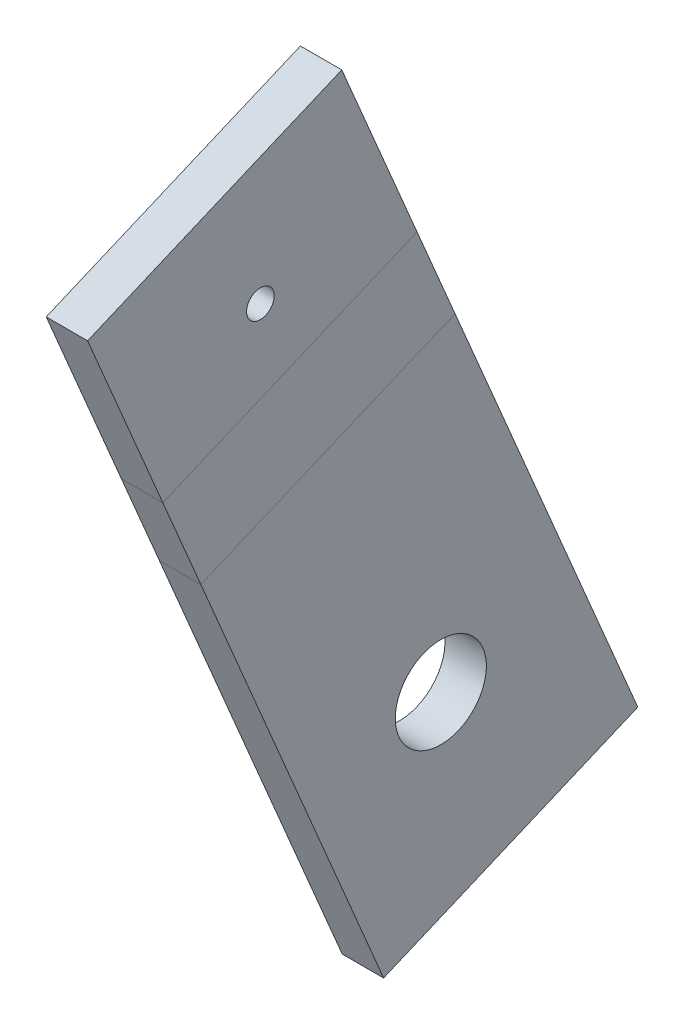
ISO-10303-21;
HEADER;
FILE_DESCRIPTION(('STEP AP214'),'2;1');
FILE_NAME('part.step','',(''),(''),'','','');
FILE_SCHEMA(('AUTOMOTIVE_DESIGN { 1 0 10303 214 1 1 1 1 }'));
ENDSEC;
DATA;
#1=APPLICATION_CONTEXT('core data for automotive mechanical design processes');
#2=APPLICATION_PROTOCOL_DEFINITION('international standard','automotive_design',2000,#1);
#3=PRODUCT_CONTEXT('',#1,'mechanical');
#4=PRODUCT('Part','Part','',(#3));
#5=PRODUCT_RELATED_PRODUCT_CATEGORY('part','',(#4));
#6=PRODUCT_DEFINITION_FORMATION('','',#4);
#7=PRODUCT_DEFINITION_CONTEXT('part definition',#1,'design');
#8=PRODUCT_DEFINITION('design','',#6,#7);
#9=PRODUCT_DEFINITION_SHAPE('','',#8);
#10=(LENGTH_UNIT() NAMED_UNIT(*) SI_UNIT(.MILLI.,.METRE.));
#11=(NAMED_UNIT(*) PLANE_ANGLE_UNIT() SI_UNIT($,.RADIAN.));
#12=(NAMED_UNIT(*) SI_UNIT($,.STERADIAN.) SOLID_ANGLE_UNIT());
#13=UNCERTAINTY_MEASURE_WITH_UNIT(LENGTH_MEASURE(1.E-05),#10,'distance_accuracy_value','');
#14=(GEOMETRIC_REPRESENTATION_CONTEXT(3) GLOBAL_UNCERTAINTY_ASSIGNED_CONTEXT((#13)) GLOBAL_UNIT_ASSIGNED_CONTEXT((#10,
#11,#12)) REPRESENTATION_CONTEXT('',''));
#15=CARTESIAN_POINT('',(0.,0.,0.));
#16=DIRECTION('',(0.,0.,1.));
#17=DIRECTION('',(1.,0.,0.));
#18=AXIS2_PLACEMENT_3D('',#15,#16,#17);
#19=CARTESIAN_POINT('',(-38.3771215803497,11.0699999084454,24.8920330878985));
#20=DIRECTION('',(0.,-0.389568980996589,0.920997290465764));
#21=DIRECTION('',(1.,0.,0.));
#22=AXIS2_PLACEMENT_3D('',#19,#20,#21);
#23=PLANE('',#22);
#24=DIRECTION('',(0.,-0.920997290465764,-0.389568980996589));
#25=VECTOR('',#24,1.);
#26=CARTESIAN_POINT('',(-38.3771215803497,11.0699999084454,24.8920330878985));
#27=LINE('',#26,#25);
#28=CARTESIAN_POINT('',(-38.3771215803498,26.7269538463634,31.5147057648405));
#29=VERTEX_POINT('',#28);
#30=CARTESIAN_POINT('',(-38.3771215803497,13.8329917798427,26.0607400308882));
#31=VERTEX_POINT('',#30);
#32=EDGE_CURVE('E180',#29,#31,#27,.T.);
#33=ORIENTED_EDGE('',*,*,#32,.T.);
#34=DIRECTION('',(-1.,0.,0.));
#35=VECTOR('',#34,1.);
#36=CARTESIAN_POINT('',(-35.3771215803497,13.8329917798427,26.0607400308882));
#37=LINE('',#36,#35);
#38=CARTESIAN_POINT('',(-35.3771215803497,13.8329917798427,26.0607400308882));
#39=VERTEX_POINT('',#38);
#40=EDGE_CURVE('E13',#39,#31,#37,.T.);
#41=ORIENTED_EDGE('',*,*,#40,.F.);
#42=DIRECTION('',(0.,0.920997290465764,0.389568980996589));
#43=VECTOR('',#42,1.);
#44=CARTESIAN_POINT('',(-35.3771215803499,43.6522330284253,38.6738622925477));
#45=LINE('',#44,#43);
#46=CARTESIAN_POINT('',(-35.3771215803498,26.7269538463634,31.5147057648405));
#47=VERTEX_POINT('',#46);
#48=EDGE_CURVE('E170',#47,#39,#45,.F.);
#49=ORIENTED_EDGE('',*,*,#48,.F.);
#50=DIRECTION('',(1.,0.,0.));
#51=VECTOR('',#50,1.);
#52=CARTESIAN_POINT('',(-38.3771215803498,26.7269538463634,31.5147057648405));
#53=LINE('',#52,#51);
#54=EDGE_CURVE('E90',#29,#47,#53,.T.);
#55=ORIENTED_EDGE('',*,*,#54,.F.);
#56=EDGE_LOOP('',(#33,#41,#49,#55));
#57=FACE_BOUND('',#56,.T.);
#58=ADVANCED_FACE('F59',(#57),#23,.T.);
#59=CARTESIAN_POINT('',(-38.3771215803498,34.5183334662952,13.0947599555252));
#60=DIRECTION('',(0.,0.389568980996589,-0.920997290465764));
#61=DIRECTION('',(-1.,0.,0.));
#62=AXIS2_PLACEMENT_3D('',#59,#60,#61);
#63=PLANE('',#62);
#64=DIRECTION('',(0.,-0.920997290465764,-0.389568980996589));
#65=VECTOR('',#64,1.);
#66=CARTESIAN_POINT('',(-35.3771215803499,51.4436126483571,20.2539164832324));
#67=LINE('',#66,#65);
#68=CARTESIAN_POINT('',(-35.3771215803497,21.6243713997745,7.64079422157293));
#69=VERTEX_POINT('',#68);
#70=CARTESIAN_POINT('',(-35.3771215803498,34.5183334662952,13.0947599555252));
#71=VERTEX_POINT('',#70);
#72=EDGE_CURVE('E97',#69,#71,#67,.F.);
#73=ORIENTED_EDGE('',*,*,#72,.F.);
#74=DIRECTION('',(-1.,0.,0.));
#75=VECTOR('',#74,1.);
#76=CARTESIAN_POINT('',(-38.3771215803497,21.6243713997745,7.64079422157295));
#77=LINE('',#76,#75);
#78=CARTESIAN_POINT('',(-38.3771215803497,21.6243713997745,7.64079422157293));
#79=VERTEX_POINT('',#78);
#80=EDGE_CURVE('E149',#69,#79,#77,.T.);
#81=ORIENTED_EDGE('',*,*,#80,.T.);
#82=DIRECTION('',(0.,0.920997290465764,0.389568980996589));
#83=VECTOR('',#82,1.);
#84=CARTESIAN_POINT('',(-38.3771215803498,34.5183334662952,13.0947599555252));
#85=LINE('',#84,#83);
#86=CARTESIAN_POINT('',(-38.3771215803498,34.5183334662952,13.0947599555252));
#87=VERTEX_POINT('',#86);
#88=EDGE_CURVE('E176',#79,#87,#85,.T.);
#89=ORIENTED_EDGE('',*,*,#88,.T.);
#90=DIRECTION('',(1.,0.,0.));
#91=VECTOR('',#90,1.);
#92=CARTESIAN_POINT('',(-38.3771215803498,34.5183334662952,13.0947599555252));
#93=LINE('',#92,#91);
#94=EDGE_CURVE('E163',#87,#71,#93,.T.);
#95=ORIENTED_EDGE('',*,*,#94,.T.);
#96=EDGE_LOOP('',(#73,#81,#89,#95));
#97=FACE_BOUND('',#96,.T.);
#98=ADVANCED_FACE('F61',(#97),#63,.T.);
#99=CARTESIAN_POINT('',(-38.3771215803499,50.9032673994056,21.531370629934));
#100=DIRECTION('',(-1.,0.,0.));
#101=DIRECTION('',(0.,-0.38956898099659,0.920997290465764));
#102=AXIS2_PLACEMENT_3D('',#99,#100,#101);
#103=PLANE('',#102);
#104=CARTESIAN_POINT('',(-38.3771215803497,22.7941666873702,18.9933965217118));
#105=DIRECTION('',(-1.,0.,0.));
#106=DIRECTION('',(0.,-0.38956898099659,0.920997290465764));
#107=AXIS2_PLACEMENT_3D('',#104,#105,#106);
#108=CIRCLE('',#107,1.);
#109=CARTESIAN_POINT('',(-38.3771215803497,22.4045977063736,19.9143938121776));
#110=VERTEX_POINT('',#109);
#111=EDGE_CURVE('E165',#110,#110,#108,.T.);
#112=ORIENTED_EDGE('',*,*,#111,.F.);
#113=EDGE_LOOP('',(#112));
#114=FACE_BOUND('',#113,.T.);
#115=ORIENTED_EDGE('',*,*,#88,.F.);
#116=DIRECTION('',(0.,-0.389568980996589,0.920997290465764));
#117=VECTOR('',#116,1.);
#118=CARTESIAN_POINT('',(-38.3771215803497,21.084026150823,8.91824836827452));
#119=LINE('',#118,#117);
#120=EDGE_CURVE('E135',#79,#31,#119,.T.);
#121=ORIENTED_EDGE('',*,*,#120,.T.);
#122=ORIENTED_EDGE('',*,*,#32,.F.);
#123=DIRECTION('',(0.,-0.38956898099659,0.920997290465764));
#124=VECTOR('',#123,1.);
#125=CARTESIAN_POINT('',(-38.3771215803498,26.7269538463634,31.5147057648405));
#126=LINE('',#125,#124);
#127=EDGE_CURVE('E178',#87,#29,#126,.T.);
#128=ORIENTED_EDGE('',*,*,#127,.F.);
#129=EDGE_LOOP('',(#115,#121,#122,#128));
#130=FACE_BOUND('',#129,.T.);
#131=ADVANCED_FACE('F228',(#114,#130),#103,.T.);
#132=CARTESIAN_POINT('',(-35.3771215803499,50.9032673994056,21.531370629934));
#133=DIRECTION('',(-1.,0.,0.));
#134=DIRECTION('',(0.,-0.38956898099659,0.920997290465764));
#135=AXIS2_PLACEMENT_3D('',#132,#133,#134);
#136=PLANE('',#135);
#137=CARTESIAN_POINT('',(-35.3771215803497,22.7941666873702,18.9933965217118));
#138=DIRECTION('',(1.,0.,0.));
#139=DIRECTION('',(0.,0.38956898099659,-0.920997290465764));
#140=AXIS2_PLACEMENT_3D('',#137,#138,#139);
#141=CIRCLE('',#140,1.);
#142=CARTESIAN_POINT('',(-35.3771215803497,23.1837356683668,18.072399231246));
#143=VERTEX_POINT('',#142);
#144=EDGE_CURVE('E187',#143,#143,#141,.T.);
#145=ORIENTED_EDGE('',*,*,#144,.F.);
#146=EDGE_LOOP('',(#145));
#147=FACE_BOUND('',#146,.T.);
#148=DIRECTION('',(0.,-0.389568980996589,0.920997290465764));
#149=VECTOR('',#148,1.);
#150=CARTESIAN_POINT('',(-35.3771215803497,21.6243713997745,7.64079422157295));
#151=LINE('',#150,#149);
#152=EDGE_CURVE('E68',#69,#39,#151,.T.);
#153=ORIENTED_EDGE('',*,*,#152,.F.);
#154=ORIENTED_EDGE('',*,*,#72,.T.);
#155=DIRECTION('',(0.,0.38956898099659,-0.920997290465764));
#156=VECTOR('',#155,1.);
#157=CARTESIAN_POINT('',(-35.3771215803498,33.9779882173437,14.3722141022268));
#158=LINE('',#157,#156);
#159=EDGE_CURVE('E164',#71,#47,#158,.F.);
#160=ORIENTED_EDGE('',*,*,#159,.T.);
#161=ORIENTED_EDGE('',*,*,#48,.T.);
#162=EDGE_LOOP('',(#153,#154,#160,#161));
#163=FACE_BOUND('',#162,.T.);
#164=ADVANCED_FACE('F168',(#147,#163),#136,.F.);
#165=CARTESIAN_POINT('',(-38.3771215803498,26.7269538463634,31.5147057648405));
#166=DIRECTION('',(0.,0.920997290465764,0.389568980996589));
#167=DIRECTION('',(-0.920997290465764,0.151763990954715,-0.35879197594737));
#168=AXIS2_PLACEMENT_3D('',#165,#166,#167);
#169=PLANE('',#168);
#170=ORIENTED_EDGE('',*,*,#159,.F.);
#171=ORIENTED_EDGE('',*,*,#94,.F.);
#172=ORIENTED_EDGE('',*,*,#127,.T.);
#173=ORIENTED_EDGE('',*,*,#54,.T.);
#174=EDGE_LOOP('',(#170,#171,#172,#173));
#175=FACE_BOUND('',#174,.T.);
#176=ADVANCED_FACE('F230',(#175),#169,.T.);
#177=CARTESIAN_POINT('',(-45.3771215803497,22.7941666873702,18.9933965217118));
#178=DIRECTION('',(1.,0.,0.));
#179=DIRECTION('',(0.,0.38956898099659,-0.920997290465764));
#180=AXIS2_PLACEMENT_3D('',#177,#178,#179);
#181=CYLINDRICAL_SURFACE('',#180,1.);
#182=ORIENTED_EDGE('',*,*,#111,.T.);
#183=EDGE_LOOP('',(#182));
#184=FACE_BOUND('',#183,.T.);
#185=ORIENTED_EDGE('',*,*,#144,.T.);
#186=EDGE_LOOP('',(#185));
#187=FACE_BOUND('',#186,.T.);
#188=ADVANCED_FACE('F232',(#184,#187),#181,.F.);
#189=CARTESIAN_POINT('',(-38.3771215803497,-23.9910623198258,10.0616938172821));
#190=DIRECTION('',(0.,0.920997290465764,0.389568980996589));
#191=DIRECTION('',(0.,0.389568980996589,-0.920997290465764));
#192=AXIS2_PLACEMENT_3D('',#189,#190,#191);
#193=PLANE('',#192);
#194=DIRECTION('',(0.,0.389568980996589,-0.920997290465764));
#195=VECTOR('',#194,1.);
#196=CARTESIAN_POINT('',(-35.3771215803497,-23.9910623198258,10.0616938172821));
#197=LINE('',#196,#195);
#198=CARTESIAN_POINT('',(-35.3771215803497,-23.9910623198258,10.0616938172821));
#199=VERTEX_POINT('',#198);
#200=CARTESIAN_POINT('',(-35.3771215803497,-16.1996826998941,-8.35825199203314));
#201=VERTEX_POINT('',#200);
#202=EDGE_CURVE('E211',#199,#201,#197,.T.);
#203=ORIENTED_EDGE('',*,*,#202,.F.);
#204=DIRECTION('',(-1.,0.,0.));
#205=VECTOR('',#204,1.);
#206=CARTESIAN_POINT('',(-38.3771215803497,-23.9910623198258,10.0616938172821));
#207=LINE('',#206,#205);
#208=CARTESIAN_POINT('',(-38.3771215803497,-23.9910623198258,10.0616938172821));
#209=VERTEX_POINT('',#208);
#210=EDGE_CURVE('E106',#199,#209,#207,.T.);
#211=ORIENTED_EDGE('',*,*,#210,.T.);
#212=DIRECTION('',(0.,0.389568980996589,-0.920997290465764));
#213=VECTOR('',#212,1.);
#214=CARTESIAN_POINT('',(-38.3771215803497,-23.9910623198258,10.0616938172821));
#215=LINE('',#214,#213);
#216=CARTESIAN_POINT('',(-38.3771215803497,-16.1996826998941,-8.35825199203314));
#217=VERTEX_POINT('',#216);
#218=EDGE_CURVE('E195',#209,#217,#215,.T.);
#219=ORIENTED_EDGE('',*,*,#218,.T.);
#220=DIRECTION('',(-1.,0.,0.));
#221=VECTOR('',#220,1.);
#222=CARTESIAN_POINT('',(-38.3771215803497,-16.1996826998941,-8.35825199203314));
#223=LINE('',#222,#221);
#224=EDGE_CURVE('E204',#201,#217,#223,.T.);
#225=ORIENTED_EDGE('',*,*,#224,.F.);
#226=EDGE_LOOP('',(#203,#211,#219,#225));
#227=FACE_BOUND('',#226,.T.);
#228=ADVANCED_FACE('F237',(#227),#193,.F.);
#229=CARTESIAN_POINT('',(-38.3771215803497,-8.122407733805,5.91611766558017));
#230=DIRECTION('',(-1.,0.,0.));
#231=DIRECTION('',(0.,0.,1.));
#232=AXIS2_PLACEMENT_3D('',#229,#230,#231);
#233=CYLINDRICAL_SURFACE('',#232,3.3);
#234=CARTESIAN_POINT('',(-38.3771215803497,-8.122407733805,5.91611766558017));
#235=DIRECTION('',(-1.,0.,0.));
#236=DIRECTION('',(0.,0.,1.));
#237=AXIS2_PLACEMENT_3D('',#234,#235,#236);
#238=CIRCLE('',#237,3.3);
#239=CARTESIAN_POINT('',(-38.3771215803497,-8.122407733805,9.21611766558017));
#240=VERTEX_POINT('',#239);
#241=EDGE_CURVE('E198',#240,#240,#238,.T.);
#242=ORIENTED_EDGE('',*,*,#241,.T.);
#243=EDGE_LOOP('',(#242));
#244=FACE_BOUND('',#243,.T.);
#245=CARTESIAN_POINT('',(-35.3771215803497,-8.122407733805,5.91611766558017));
#246=DIRECTION('',(-1.,0.,0.));
#247=DIRECTION('',(0.,0.,1.));
#248=AXIS2_PLACEMENT_3D('',#245,#246,#247);
#249=CIRCLE('',#248,3.3);
#250=CARTESIAN_POINT('',(-35.3771215803497,-8.122407733805,9.21611766558017));
#251=VERTEX_POINT('',#250);
#252=EDGE_CURVE('E208',#251,#251,#249,.T.);
#253=ORIENTED_EDGE('',*,*,#252,.F.);
#254=EDGE_LOOP('',(#253));
#255=FACE_BOUND('',#254,.T.);
#256=ADVANCED_FACE('F265',(#244,#255),#233,.F.);
#257=CARTESIAN_POINT('',(-38.3771215803497,-23.9910623198258,10.0616938172821));
#258=DIRECTION('',(-1.,0.,0.));
#259=DIRECTION('',(0.,0.,1.));
#260=AXIS2_PLACEMENT_3D('',#257,#258,#259);
#261=PLANE('',#260);
#262=ORIENTED_EDGE('',*,*,#241,.F.);
#263=EDGE_LOOP('',(#262));
#264=FACE_BOUND('',#263,.T.);
#265=DIRECTION('',(0.,0.920997290465764,0.389568980996589));
#266=VECTOR('',#265,1.);
#267=CARTESIAN_POINT('',(-38.3771215803497,-23.9910623198258,10.0616938172821));
#268=LINE('',#267,#266);
#269=CARTESIAN_POINT('',(-38.3771215803497,7.32284555601015,23.3070391711662));
#270=VERTEX_POINT('',#269);
#271=EDGE_CURVE('E130',#209,#270,#268,.T.);
#272=ORIENTED_EDGE('',*,*,#271,.T.);
#273=DIRECTION('',(0.,0.389568980996589,-0.920997290465764));
#274=VECTOR('',#273,1.);
#275=CARTESIAN_POINT('',(-38.3771215803497,7.32284555601015,23.3070391711662));
#276=LINE('',#275,#274);
#277=CARTESIAN_POINT('',(-38.3771215803497,15.1142251759419,4.88709336185089));
#278=VERTEX_POINT('',#277);
#279=EDGE_CURVE('E202',#270,#278,#276,.T.);
#280=ORIENTED_EDGE('',*,*,#279,.T.);
#281=DIRECTION('',(0.,0.920997290465764,0.389568980996589));
#282=VECTOR('',#281,1.);
#283=CARTESIAN_POINT('',(-38.3771215803497,-16.1996826998941,-8.35825199203314));
#284=LINE('',#283,#282);
#285=EDGE_CURVE('E206',#217,#278,#284,.T.);
#286=ORIENTED_EDGE('',*,*,#285,.F.);
#287=ORIENTED_EDGE('',*,*,#218,.F.);
#288=EDGE_LOOP('',(#272,#280,#286,#287));
#289=FACE_BOUND('',#288,.T.);
#290=ADVANCED_FACE('F261',(#264,#289),#261,.T.);
#291=CARTESIAN_POINT('',(-38.3771215803497,-16.1996826998941,-8.35825199203314));
#292=DIRECTION('',(0.,-0.389568980996589,0.920997290465764));
#293=DIRECTION('',(0.,0.920997290465764,0.389568980996589));
#294=AXIS2_PLACEMENT_3D('',#291,#292,#293);
#295=PLANE('',#294);
#296=DIRECTION('',(-1.,0.,0.));
#297=VECTOR('',#296,1.);
#298=CARTESIAN_POINT('',(-35.3771215803497,15.1142251759419,4.88709336185091));
#299=LINE('',#298,#297);
#300=CARTESIAN_POINT('',(-35.3771215803497,15.1142251759419,4.88709336185091));
#301=VERTEX_POINT('',#300);
#302=EDGE_CURVE('E192',#301,#278,#299,.T.);
#303=ORIENTED_EDGE('',*,*,#302,.F.);
#304=DIRECTION('',(0.,0.920997290465764,0.389568980996589));
#305=VECTOR('',#304,1.);
#306=CARTESIAN_POINT('',(-35.3771215803497,-16.1996826998941,-8.35825199203314));
#307=LINE('',#306,#305);
#308=EDGE_CURVE('E214',#201,#301,#307,.T.);
#309=ORIENTED_EDGE('',*,*,#308,.F.);
#310=ORIENTED_EDGE('',*,*,#224,.T.);
#311=ORIENTED_EDGE('',*,*,#285,.T.);
#312=EDGE_LOOP('',(#303,#309,#310,#311));
#313=FACE_BOUND('',#312,.T.);
#314=ADVANCED_FACE('F257',(#313),#295,.F.);
#315=CARTESIAN_POINT('',(-35.3771215803497,-23.9910623198258,10.0616938172821));
#316=DIRECTION('',(-1.,0.,0.));
#317=DIRECTION('',(0.,0.,1.));
#318=AXIS2_PLACEMENT_3D('',#315,#316,#317);
#319=PLANE('',#318);
#320=ORIENTED_EDGE('',*,*,#252,.T.);
#321=EDGE_LOOP('',(#320));
#322=FACE_BOUND('',#321,.T.);
#323=DIRECTION('',(0.,0.389568980996589,-0.920997290465764));
#324=VECTOR('',#323,1.);
#325=CARTESIAN_POINT('',(-35.3771215803497,7.32284555601015,23.3070391711662));
#326=LINE('',#325,#324);
#327=CARTESIAN_POINT('',(-35.3771215803497,7.32284555601015,23.3070391711662));
#328=VERTEX_POINT('',#327);
#329=EDGE_CURVE('E159',#328,#301,#326,.T.);
#330=ORIENTED_EDGE('',*,*,#329,.F.);
#331=DIRECTION('',(0.,0.920997290465764,0.389568980996589));
#332=VECTOR('',#331,1.);
#333=CARTESIAN_POINT('',(-35.3771215803497,-23.9910623198258,10.0616938172821));
#334=LINE('',#333,#332);
#335=EDGE_CURVE('E123',#199,#328,#334,.T.);
#336=ORIENTED_EDGE('',*,*,#335,.F.);
#337=ORIENTED_EDGE('',*,*,#202,.T.);
#338=ORIENTED_EDGE('',*,*,#308,.T.);
#339=EDGE_LOOP('',(#330,#336,#337,#338));
#340=FACE_BOUND('',#339,.T.);
#341=ADVANCED_FACE('F254',(#322,#340),#319,.F.);
#342=CARTESIAN_POINT('',(-38.3771215803497,-23.9910623198258,10.0616938172821));
#343=DIRECTION('',(0.,-0.389568980996589,0.920997290465764));
#344=DIRECTION('',(0.,0.920997290465764,0.389568980996589));
#345=AXIS2_PLACEMENT_3D('',#342,#343,#344);
#346=PLANE('',#345);
#347=ORIENTED_EDGE('',*,*,#335,.T.);
#348=DIRECTION('',(-1.,0.,0.));
#349=VECTOR('',#348,1.);
#350=CARTESIAN_POINT('',(-35.3771215803497,7.32284555601015,23.3070391711662));
#351=LINE('',#350,#349);
#352=EDGE_CURVE('E190',#328,#270,#351,.T.);
#353=ORIENTED_EDGE('',*,*,#352,.T.);
#354=ORIENTED_EDGE('',*,*,#271,.F.);
#355=ORIENTED_EDGE('',*,*,#210,.F.);
#356=EDGE_LOOP('',(#347,#353,#354,#355));
#357=FACE_BOUND('',#356,.T.);
#358=ADVANCED_FACE('F251',(#357),#346,.T.);
#359=CARTESIAN_POINT('',(-38.3771215803497,13.8329917798427,26.0607400308882));
#360=DIRECTION('',(0.,-0.389568980996589,0.920997290465764));
#361=DIRECTION('',(0.,0.920997290465764,0.389568980996589));
#362=AXIS2_PLACEMENT_3D('',#359,#360,#361);
#363=PLANE('',#362);
#364=ORIENTED_EDGE('',*,*,#352,.F.);
#365=DIRECTION('',(0.,0.920997290465764,0.389568980996589));
#366=VECTOR('',#365,1.);
#367=CARTESIAN_POINT('',(-35.3771215803497,13.8329917798427,26.0607400308882));
#368=LINE('',#367,#366);
#369=EDGE_CURVE('E160',#328,#39,#368,.T.);
#370=ORIENTED_EDGE('',*,*,#369,.T.);
#371=ORIENTED_EDGE('',*,*,#40,.T.);
#372=DIRECTION('',(0.,0.920997290465764,0.389568980996589));
#373=VECTOR('',#372,1.);
#374=CARTESIAN_POINT('',(-38.3771215803497,13.8329917798427,26.0607400308882));
#375=LINE('',#374,#373);
#376=EDGE_CURVE('E76',#270,#31,#375,.T.);
#377=ORIENTED_EDGE('',*,*,#376,.F.);
#378=EDGE_LOOP('',(#364,#370,#371,#377));
#379=FACE_BOUND('',#378,.T.);
#380=ADVANCED_FACE('F224',(#379),#363,.T.);
#381=CARTESIAN_POINT('',(-38.3771215803497,15.1142251759419,4.8870933618509));
#382=DIRECTION('',(0.,0.38956898099659,-0.920997290465764));
#383=DIRECTION('',(0.,-0.920997290465764,-0.38956898099659));
#384=AXIS2_PLACEMENT_3D('',#381,#382,#383);
#385=PLANE('',#384);
#386=DIRECTION('',(0.,-0.920997290465764,-0.38956898099659));
#387=VECTOR('',#386,1.);
#388=CARTESIAN_POINT('',(-35.3771215803497,15.1142251759419,4.8870933618509));
#389=LINE('',#388,#387);
#390=EDGE_CURVE('E152',#69,#301,#389,.T.);
#391=ORIENTED_EDGE('',*,*,#390,.T.);
#392=ORIENTED_EDGE('',*,*,#302,.T.);
#393=DIRECTION('',(0.,-0.920997290465764,-0.38956898099659));
#394=VECTOR('',#393,1.);
#395=CARTESIAN_POINT('',(-38.3771215803497,15.1142251759419,4.8870933618509));
#396=LINE('',#395,#394);
#397=EDGE_CURVE('E153',#79,#278,#396,.T.);
#398=ORIENTED_EDGE('',*,*,#397,.F.);
#399=ORIENTED_EDGE('',*,*,#80,.F.);
#400=EDGE_LOOP('',(#391,#392,#398,#399));
#401=FACE_BOUND('',#400,.T.);
#402=ADVANCED_FACE('F150',(#401),#385,.T.);
#403=CARTESIAN_POINT('',(-38.3771215803497,14.4736084778923,15.4739166963696));
#404=DIRECTION('',(-1.,0.,0.));
#405=DIRECTION('',(0.,0.,1.));
#406=AXIS2_PLACEMENT_3D('',#403,#404,#405);
#407=PLANE('',#406);
#408=ORIENTED_EDGE('',*,*,#120,.F.);
#409=ORIENTED_EDGE('',*,*,#397,.T.);
#410=ORIENTED_EDGE('',*,*,#279,.F.);
#411=ORIENTED_EDGE('',*,*,#376,.T.);
#412=EDGE_LOOP('',(#408,#409,#410,#411));
#413=FACE_BOUND('',#412,.T.);
#414=ADVANCED_FACE('F220',(#413),#407,.T.);
#415=CARTESIAN_POINT('',(-35.3771215803497,14.4736084778923,15.4739166963696));
#416=DIRECTION('',(-1.,0.,0.));
#417=DIRECTION('',(0.,0.,1.));
#418=AXIS2_PLACEMENT_3D('',#415,#416,#417);
#419=PLANE('',#418);
#420=ORIENTED_EDGE('',*,*,#152,.T.);
#421=ORIENTED_EDGE('',*,*,#369,.F.);
#422=ORIENTED_EDGE('',*,*,#329,.T.);
#423=ORIENTED_EDGE('',*,*,#390,.F.);
#424=EDGE_LOOP('',(#420,#421,#422,#423));
#425=FACE_BOUND('',#424,.T.);
#426=ADVANCED_FACE('F158',(#425),#419,.F.);
#427=CLOSED_SHELL('',(#58,#98,#131,#164,#176,#188,#228,#256,#290,#314,#341,#358,#380,#402,#414,#426));
#428=MANIFOLD_SOLID_BREP('B2',#427);
#429=ADVANCED_BREP_SHAPE_REPRESENTATION('',(#18,#428),#14);
#430=SHAPE_DEFINITION_REPRESENTATION(#9,#429);
ENDSEC;
END-ISO-10303-21;
